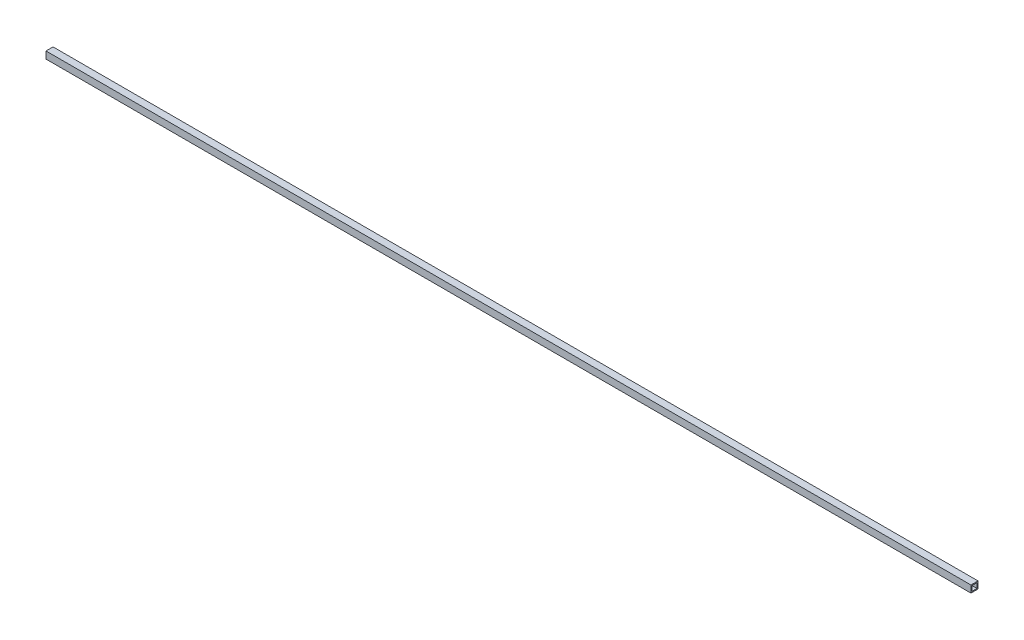
ISO-10303-21;
HEADER;
FILE_DESCRIPTION(('STEP AP214'),'2;1');
FILE_NAME('part.step','',(''),(''),'','','');
FILE_SCHEMA(('AUTOMOTIVE_DESIGN { 1 0 10303 214 1 1 1 1 }'));
ENDSEC;
DATA;
#1=APPLICATION_CONTEXT('core data for automotive mechanical design processes');
#2=APPLICATION_PROTOCOL_DEFINITION('international standard','automotive_design',2000,#1);
#3=PRODUCT_CONTEXT('',#1,'mechanical');
#4=PRODUCT('Part','Part','',(#3));
#5=PRODUCT_RELATED_PRODUCT_CATEGORY('part','',(#4));
#6=PRODUCT_DEFINITION_FORMATION('','',#4);
#7=PRODUCT_DEFINITION_CONTEXT('part definition',#1,'design');
#8=PRODUCT_DEFINITION('design','',#6,#7);
#9=PRODUCT_DEFINITION_SHAPE('','',#8);
#10=(LENGTH_UNIT() NAMED_UNIT(*) SI_UNIT(.MILLI.,.METRE.));
#11=(NAMED_UNIT(*) PLANE_ANGLE_UNIT() SI_UNIT($,.RADIAN.));
#12=(NAMED_UNIT(*) SI_UNIT($,.STERADIAN.) SOLID_ANGLE_UNIT());
#13=UNCERTAINTY_MEASURE_WITH_UNIT(LENGTH_MEASURE(1.E-05),#10,'distance_accuracy_value','');
#14=(GEOMETRIC_REPRESENTATION_CONTEXT(3) GLOBAL_UNCERTAINTY_ASSIGNED_CONTEXT((#13)) GLOBAL_UNIT_ASSIGNED_CONTEXT((#10,
#11,#12)) REPRESENTATION_CONTEXT('',''));
#15=CARTESIAN_POINT('',(0.,0.,0.));
#16=DIRECTION('',(0.,0.,1.));
#17=DIRECTION('',(1.,0.,0.));
#18=AXIS2_PLACEMENT_3D('',#15,#16,#17);
#19=CARTESIAN_POINT('',(0.,10.,0.));
#20=DIRECTION('',(1.,0.,0.));
#21=DIRECTION('',(0.,0.,-1.));
#22=AXIS2_PLACEMENT_3D('',#19,#20,#21);
#23=PLANE('',#22);
#24=DIRECTION('',(0.,0.,-1.));
#25=VECTOR('',#24,1.);
#26=CARTESIAN_POINT('',(0.,1.5,1.5));
#27=LINE('',#26,#25);
#28=CARTESIAN_POINT('',(0.,1.5,8.5));
#29=VERTEX_POINT('',#28);
#30=CARTESIAN_POINT('',(0.,1.5,1.5));
#31=VERTEX_POINT('',#30);
#32=EDGE_CURVE('E115',#29,#31,#27,.T.);
#33=ORIENTED_EDGE('',*,*,#32,.T.);
#34=DIRECTION('',(0.,1.,0.));
#35=VECTOR('',#34,1.);
#36=CARTESIAN_POINT('',(0.,8.5,1.5));
#37=LINE('',#36,#35);
#38=CARTESIAN_POINT('',(0.,8.5,1.5));
#39=VERTEX_POINT('',#38);
#40=EDGE_CURVE('E108',#31,#39,#37,.T.);
#41=ORIENTED_EDGE('',*,*,#40,.T.);
#42=DIRECTION('',(0.,0.,1.));
#43=VECTOR('',#42,1.);
#44=CARTESIAN_POINT('',(0.,8.5,1.5));
#45=LINE('',#44,#43);
#46=CARTESIAN_POINT('',(0.,8.5,8.5));
#47=VERTEX_POINT('',#46);
#48=EDGE_CURVE('E118',#39,#47,#45,.T.);
#49=ORIENTED_EDGE('',*,*,#48,.T.);
#50=DIRECTION('',(0.,-1.,0.));
#51=VECTOR('',#50,1.);
#52=CARTESIAN_POINT('',(0.,8.5,8.5));
#53=LINE('',#52,#51);
#54=EDGE_CURVE('E56',#47,#29,#53,.T.);
#55=ORIENTED_EDGE('',*,*,#54,.T.);
#56=EDGE_LOOP('',(#33,#41,#49,#55));
#57=FACE_BOUND('',#56,.T.);
#58=DIRECTION('',(0.,0.,1.));
#59=VECTOR('',#58,1.);
#60=CARTESIAN_POINT('',(0.,0.,0.));
#61=LINE('',#60,#59);
#62=CARTESIAN_POINT('',(0.,0.,0.));
#63=VERTEX_POINT('',#62);
#64=CARTESIAN_POINT('',(0.,0.,10.));
#65=VERTEX_POINT('',#64);
#66=EDGE_CURVE('E148',#63,#65,#61,.T.);
#67=ORIENTED_EDGE('',*,*,#66,.T.);
#68=DIRECTION('',(0.,-1.,0.));
#69=VECTOR('',#68,1.);
#70=CARTESIAN_POINT('',(0.,10.,10.));
#71=LINE('',#70,#69);
#72=CARTESIAN_POINT('',(0.,10.,10.));
#73=VERTEX_POINT('',#72);
#74=EDGE_CURVE('E11',#73,#65,#71,.T.);
#75=ORIENTED_EDGE('',*,*,#74,.F.);
#76=DIRECTION('',(0.,0.,1.));
#77=VECTOR('',#76,1.);
#78=CARTESIAN_POINT('',(0.,10.,0.));
#79=LINE('',#78,#77);
#80=CARTESIAN_POINT('',(0.,10.,0.));
#81=VERTEX_POINT('',#80);
#82=EDGE_CURVE('E154',#81,#73,#79,.T.);
#83=ORIENTED_EDGE('',*,*,#82,.F.);
#84=DIRECTION('',(0.,-1.,0.));
#85=VECTOR('',#84,1.);
#86=CARTESIAN_POINT('',(0.,10.,0.));
#87=LINE('',#86,#85);
#88=EDGE_CURVE('E170',#81,#63,#87,.T.);
#89=ORIENTED_EDGE('',*,*,#88,.T.);
#90=EDGE_LOOP('',(#67,#75,#83,#89));
#91=FACE_BOUND('',#90,.T.);
#92=ADVANCED_FACE('F41',(#57,#91),#23,.F.);
#93=CARTESIAN_POINT('',(0.,10.,10.));
#94=DIRECTION('',(0.,0.,-1.));
#95=DIRECTION('',(-1.,0.,0.));
#96=AXIS2_PLACEMENT_3D('',#93,#94,#95);
#97=PLANE('',#96);
#98=DIRECTION('',(1.,0.,0.));
#99=VECTOR('',#98,1.);
#100=CARTESIAN_POINT('',(0.,0.,10.));
#101=LINE('',#100,#99);
#102=CARTESIAN_POINT('',(1310.,0.,10.));
#103=VERTEX_POINT('',#102);
#104=EDGE_CURVE('E174',#65,#103,#101,.T.);
#105=ORIENTED_EDGE('',*,*,#104,.T.);
#106=DIRECTION('',(0.,-1.,0.));
#107=VECTOR('',#106,1.);
#108=CARTESIAN_POINT('',(1310.,10.,10.));
#109=LINE('',#108,#107);
#110=CARTESIAN_POINT('',(1310.,10.,10.));
#111=VERTEX_POINT('',#110);
#112=EDGE_CURVE('E49',#111,#103,#109,.T.);
#113=ORIENTED_EDGE('',*,*,#112,.F.);
#114=DIRECTION('',(1.,0.,0.));
#115=VECTOR('',#114,1.);
#116=CARTESIAN_POINT('',(0.,10.,10.));
#117=LINE('',#116,#115);
#118=EDGE_CURVE('E158',#73,#111,#117,.T.);
#119=ORIENTED_EDGE('',*,*,#118,.F.);
#120=ORIENTED_EDGE('',*,*,#74,.T.);
#121=EDGE_LOOP('',(#105,#113,#119,#120));
#122=FACE_BOUND('',#121,.T.);
#123=ADVANCED_FACE('F196',(#122),#97,.F.);
#124=CARTESIAN_POINT('',(1310.,10.,0.));
#125=DIRECTION('',(1.,0.,0.));
#126=DIRECTION('',(0.,0.,-1.));
#127=AXIS2_PLACEMENT_3D('',#124,#125,#126);
#128=PLANE('',#127);
#129=DIRECTION('',(0.,1.,0.));
#130=VECTOR('',#129,1.);
#131=CARTESIAN_POINT('',(1310.,8.5,1.5));
#132=LINE('',#131,#130);
#133=CARTESIAN_POINT('',(1310.,1.5,1.5));
#134=VERTEX_POINT('',#133);
#135=CARTESIAN_POINT('',(1310.,8.5,1.5));
#136=VERTEX_POINT('',#135);
#137=EDGE_CURVE('E64',#134,#136,#132,.T.);
#138=ORIENTED_EDGE('',*,*,#137,.F.);
#139=DIRECTION('',(0.,0.,-1.));
#140=VECTOR('',#139,1.);
#141=CARTESIAN_POINT('',(1310.,1.5,1.5));
#142=LINE('',#141,#140);
#143=CARTESIAN_POINT('',(1310.,1.5,8.5));
#144=VERTEX_POINT('',#143);
#145=EDGE_CURVE('E126',#144,#134,#142,.T.);
#146=ORIENTED_EDGE('',*,*,#145,.F.);
#147=DIRECTION('',(0.,-1.,0.));
#148=VECTOR('',#147,1.);
#149=CARTESIAN_POINT('',(1310.,8.5,8.5));
#150=LINE('',#149,#148);
#151=CARTESIAN_POINT('',(1310.,8.5,8.5));
#152=VERTEX_POINT('',#151);
#153=EDGE_CURVE('E130',#152,#144,#150,.T.);
#154=ORIENTED_EDGE('',*,*,#153,.F.);
#155=DIRECTION('',(0.,0.,1.));
#156=VECTOR('',#155,1.);
#157=CARTESIAN_POINT('',(1310.,8.5,1.5));
#158=LINE('',#157,#156);
#159=EDGE_CURVE('E139',#136,#152,#158,.T.);
#160=ORIENTED_EDGE('',*,*,#159,.F.);
#161=EDGE_LOOP('',(#138,#146,#154,#160));
#162=FACE_BOUND('',#161,.T.);
#163=DIRECTION('',(0.,0.,1.));
#164=VECTOR('',#163,1.);
#165=CARTESIAN_POINT('',(1310.,0.,0.));
#166=LINE('',#165,#164);
#167=CARTESIAN_POINT('',(1310.,0.,0.));
#168=VERTEX_POINT('',#167);
#169=EDGE_CURVE('E178',#168,#103,#166,.T.);
#170=ORIENTED_EDGE('',*,*,#169,.F.);
#171=DIRECTION('',(0.,-1.,0.));
#172=VECTOR('',#171,1.);
#173=CARTESIAN_POINT('',(1310.,10.,0.));
#174=LINE('',#173,#172);
#175=CARTESIAN_POINT('',(1310.,10.,0.));
#176=VERTEX_POINT('',#175);
#177=EDGE_CURVE('E187',#176,#168,#174,.T.);
#178=ORIENTED_EDGE('',*,*,#177,.F.);
#179=DIRECTION('',(0.,0.,1.));
#180=VECTOR('',#179,1.);
#181=CARTESIAN_POINT('',(1310.,10.,0.));
#182=LINE('',#181,#180);
#183=EDGE_CURVE('E162',#176,#111,#182,.T.);
#184=ORIENTED_EDGE('',*,*,#183,.T.);
#185=ORIENTED_EDGE('',*,*,#112,.T.);
#186=EDGE_LOOP('',(#170,#178,#184,#185));
#187=FACE_BOUND('',#186,.T.);
#188=ADVANCED_FACE('F193',(#162,#187),#128,.T.);
#189=CARTESIAN_POINT('',(0.,10.,0.));
#190=DIRECTION('',(0.,0.,-1.));
#191=DIRECTION('',(-1.,0.,0.));
#192=AXIS2_PLACEMENT_3D('',#189,#190,#191);
#193=PLANE('',#192);
#194=DIRECTION('',(1.,0.,0.));
#195=VECTOR('',#194,1.);
#196=CARTESIAN_POINT('',(0.,0.,0.));
#197=LINE('',#196,#195);
#198=EDGE_CURVE('E159',#63,#168,#197,.T.);
#199=ORIENTED_EDGE('',*,*,#198,.F.);
#200=ORIENTED_EDGE('',*,*,#88,.F.);
#201=DIRECTION('',(1.,0.,0.));
#202=VECTOR('',#201,1.);
#203=CARTESIAN_POINT('',(0.,10.,0.));
#204=LINE('',#203,#202);
#205=EDGE_CURVE('E166',#81,#176,#204,.T.);
#206=ORIENTED_EDGE('',*,*,#205,.T.);
#207=ORIENTED_EDGE('',*,*,#177,.T.);
#208=EDGE_LOOP('',(#199,#200,#206,#207));
#209=FACE_BOUND('',#208,.T.);
#210=ADVANCED_FACE('F203',(#209),#193,.T.);
#211=CARTESIAN_POINT('',(0.,10.,0.));
#212=DIRECTION('',(0.,1.,0.));
#213=DIRECTION('',(0.,0.,1.));
#214=AXIS2_PLACEMENT_3D('',#211,#212,#213);
#215=PLANE('',#214);
#216=ORIENTED_EDGE('',*,*,#82,.T.);
#217=ORIENTED_EDGE('',*,*,#118,.T.);
#218=ORIENTED_EDGE('',*,*,#183,.F.);
#219=ORIENTED_EDGE('',*,*,#205,.F.);
#220=EDGE_LOOP('',(#216,#217,#218,#219));
#221=FACE_BOUND('',#220,.T.);
#222=ADVANCED_FACE('F207',(#221),#215,.T.);
#223=CARTESIAN_POINT('',(0.,0.,0.));
#224=DIRECTION('',(0.,1.,0.));
#225=DIRECTION('',(0.,0.,1.));
#226=AXIS2_PLACEMENT_3D('',#223,#224,#225);
#227=PLANE('',#226);
#228=ORIENTED_EDGE('',*,*,#66,.F.);
#229=ORIENTED_EDGE('',*,*,#198,.T.);
#230=ORIENTED_EDGE('',*,*,#169,.T.);
#231=ORIENTED_EDGE('',*,*,#104,.F.);
#232=EDGE_LOOP('',(#228,#229,#230,#231));
#233=FACE_BOUND('',#232,.T.);
#234=ADVANCED_FACE('F200',(#233),#227,.F.);
#235=CARTESIAN_POINT('',(0.,8.5,1.5));
#236=DIRECTION('',(0.,0.,-1.));
#237=DIRECTION('',(0.,1.,0.));
#238=AXIS2_PLACEMENT_3D('',#235,#236,#237);
#239=PLANE('',#238);
#240=ORIENTED_EDGE('',*,*,#137,.T.);
#241=DIRECTION('',(1.,0.,0.));
#242=VECTOR('',#241,1.);
#243=CARTESIAN_POINT('',(0.,8.5,1.5));
#244=LINE('',#243,#242);
#245=EDGE_CURVE('E104',#39,#136,#244,.T.);
#246=ORIENTED_EDGE('',*,*,#245,.F.);
#247=ORIENTED_EDGE('',*,*,#40,.F.);
#248=DIRECTION('',(1.,0.,0.));
#249=VECTOR('',#248,1.);
#250=CARTESIAN_POINT('',(0.,1.5,1.5));
#251=LINE('',#250,#249);
#252=EDGE_CURVE('E145',#31,#134,#251,.T.);
#253=ORIENTED_EDGE('',*,*,#252,.T.);
#254=EDGE_LOOP('',(#240,#246,#247,#253));
#255=FACE_BOUND('',#254,.T.);
#256=ADVANCED_FACE('F106',(#255),#239,.F.);
#257=CARTESIAN_POINT('',(0.,1.5,1.5));
#258=DIRECTION('',(0.,-1.,0.));
#259=DIRECTION('',(0.,0.,-1.));
#260=AXIS2_PLACEMENT_3D('',#257,#258,#259);
#261=PLANE('',#260);
#262=ORIENTED_EDGE('',*,*,#145,.T.);
#263=ORIENTED_EDGE('',*,*,#252,.F.);
#264=ORIENTED_EDGE('',*,*,#32,.F.);
#265=DIRECTION('',(1.,0.,0.));
#266=VECTOR('',#265,1.);
#267=CARTESIAN_POINT('',(0.,1.5,8.5));
#268=LINE('',#267,#266);
#269=EDGE_CURVE('E149',#29,#144,#268,.T.);
#270=ORIENTED_EDGE('',*,*,#269,.T.);
#271=EDGE_LOOP('',(#262,#263,#264,#270));
#272=FACE_BOUND('',#271,.T.);
#273=ADVANCED_FACE('F226',(#272),#261,.F.);
#274=CARTESIAN_POINT('',(0.,8.5,8.5));
#275=DIRECTION('',(0.,0.,1.));
#276=DIRECTION('',(1.,0.,0.));
#277=AXIS2_PLACEMENT_3D('',#274,#275,#276);
#278=PLANE('',#277);
#279=ORIENTED_EDGE('',*,*,#153,.T.);
#280=ORIENTED_EDGE('',*,*,#269,.F.);
#281=ORIENTED_EDGE('',*,*,#54,.F.);
#282=DIRECTION('',(1.,0.,0.));
#283=VECTOR('',#282,1.);
#284=CARTESIAN_POINT('',(0.,8.5,8.5));
#285=LINE('',#284,#283);
#286=EDGE_CURVE('E114',#47,#152,#285,.T.);
#287=ORIENTED_EDGE('',*,*,#286,.T.);
#288=EDGE_LOOP('',(#279,#280,#281,#287));
#289=FACE_BOUND('',#288,.T.);
#290=ADVANCED_FACE('F229',(#289),#278,.F.);
#291=CARTESIAN_POINT('',(0.,8.5,1.5));
#292=DIRECTION('',(0.,1.,0.));
#293=DIRECTION('',(0.,0.,1.));
#294=AXIS2_PLACEMENT_3D('',#291,#292,#293);
#295=PLANE('',#294);
#296=ORIENTED_EDGE('',*,*,#159,.T.);
#297=ORIENTED_EDGE('',*,*,#286,.F.);
#298=ORIENTED_EDGE('',*,*,#48,.F.);
#299=ORIENTED_EDGE('',*,*,#245,.T.);
#300=EDGE_LOOP('',(#296,#297,#298,#299));
#301=FACE_BOUND('',#300,.T.);
#302=ADVANCED_FACE('F119',(#301),#295,.F.);
#303=CLOSED_SHELL('',(#92,#123,#188,#210,#222,#234,#256,#273,#290,#302));
#304=MANIFOLD_SOLID_BREP('B2',#303);
#305=ADVANCED_BREP_SHAPE_REPRESENTATION('',(#18,#304),#14);
#306=SHAPE_DEFINITION_REPRESENTATION(#9,#305);
ENDSEC;
END-ISO-10303-21;
